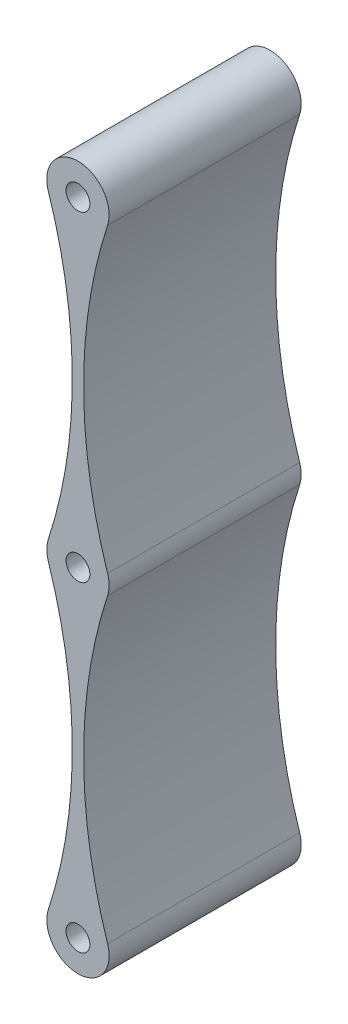
ISO-10303-21;
HEADER;
FILE_DESCRIPTION(('STEP AP214'),'2;1');
FILE_NAME('part.step','',(''),(''),'','','');
FILE_SCHEMA(('AUTOMOTIVE_DESIGN { 1 0 10303 214 1 1 1 1 }'));
ENDSEC;
DATA;
#1=APPLICATION_CONTEXT('core data for automotive mechanical design processes');
#2=APPLICATION_PROTOCOL_DEFINITION('international standard','automotive_design',2000,#1);
#3=PRODUCT_CONTEXT('',#1,'mechanical');
#4=PRODUCT('Part','Part','',(#3));
#5=PRODUCT_RELATED_PRODUCT_CATEGORY('part','',(#4));
#6=PRODUCT_DEFINITION_FORMATION('','',#4);
#7=PRODUCT_DEFINITION_CONTEXT('part definition',#1,'design');
#8=PRODUCT_DEFINITION('design','',#6,#7);
#9=PRODUCT_DEFINITION_SHAPE('','',#8);
#10=(LENGTH_UNIT() NAMED_UNIT(*) SI_UNIT(.MILLI.,.METRE.));
#11=(NAMED_UNIT(*) PLANE_ANGLE_UNIT() SI_UNIT($,.RADIAN.));
#12=(NAMED_UNIT(*) SI_UNIT($,.STERADIAN.) SOLID_ANGLE_UNIT());
#13=UNCERTAINTY_MEASURE_WITH_UNIT(LENGTH_MEASURE(1.E-05),#10,'distance_accuracy_value','');
#14=(GEOMETRIC_REPRESENTATION_CONTEXT(3) GLOBAL_UNCERTAINTY_ASSIGNED_CONTEXT((#13)) GLOBAL_UNIT_ASSIGNED_CONTEXT((#10,
#11,#12)) REPRESENTATION_CONTEXT('',''));
#15=CARTESIAN_POINT('',(0.,0.,0.));
#16=DIRECTION('',(0.,0.,1.));
#17=DIRECTION('',(1.,0.,0.));
#18=AXIS2_PLACEMENT_3D('',#15,#16,#17);
#19=CARTESIAN_POINT('',(0.,-10.5,141.636166032964));
#20=DIRECTION('',(0.,0.,-1.));
#21=DIRECTION('',(-1.,0.,0.));
#22=AXIS2_PLACEMENT_3D('',#19,#20,#21);
#23=CYLINDRICAL_SURFACE('',#22,2.1);
#24=CARTESIAN_POINT('',(0.,-10.5,16.95));
#25=DIRECTION('',(0.,0.,1.));
#26=DIRECTION('',(1.,0.,0.));
#27=AXIS2_PLACEMENT_3D('',#24,#25,#26);
#28=CIRCLE('',#27,2.1);
#29=CARTESIAN_POINT('',(2.1,-10.5,16.95));
#30=VERTEX_POINT('',#29);
#31=EDGE_CURVE('E144',#30,#30,#28,.T.);
#32=ORIENTED_EDGE('',*,*,#31,.T.);
#33=EDGE_LOOP('',(#32));
#34=FACE_BOUND('',#33,.T.);
#35=CARTESIAN_POINT('',(0.,-10.5,-16.95));
#36=DIRECTION('',(0.,0.,1.));
#37=DIRECTION('',(1.,0.,0.));
#38=AXIS2_PLACEMENT_3D('',#35,#36,#37);
#39=CIRCLE('',#38,2.1);
#40=CARTESIAN_POINT('',(2.1,-10.5,-16.95));
#41=VERTEX_POINT('',#40);
#42=EDGE_CURVE('E120',#41,#41,#39,.F.);
#43=ORIENTED_EDGE('',*,*,#42,.T.);
#44=EDGE_LOOP('',(#43));
#45=FACE_BOUND('',#44,.T.);
#46=ADVANCED_FACE('F33',(#34,#45),#23,.F.);
#47=CARTESIAN_POINT('',(0.,-123.7,141.636166032964));
#48=DIRECTION('',(0.,0.,-1.));
#49=DIRECTION('',(-1.,0.,0.));
#50=AXIS2_PLACEMENT_3D('',#47,#48,#49);
#51=CYLINDRICAL_SURFACE('',#50,2.1);
#52=CARTESIAN_POINT('',(0.,-123.7,16.95));
#53=DIRECTION('',(0.,0.,1.));
#54=DIRECTION('',(1.,0.,0.));
#55=AXIS2_PLACEMENT_3D('',#52,#53,#54);
#56=CIRCLE('',#55,2.1);
#57=CARTESIAN_POINT('',(2.10000000000001,-123.7,16.95));
#58=VERTEX_POINT('',#57);
#59=EDGE_CURVE('E147',#58,#58,#56,.T.);
#60=ORIENTED_EDGE('',*,*,#59,.T.);
#61=EDGE_LOOP('',(#60));
#62=FACE_BOUND('',#61,.T.);
#63=CARTESIAN_POINT('',(0.,-123.7,-16.95));
#64=DIRECTION('',(0.,0.,1.));
#65=DIRECTION('',(1.,0.,0.));
#66=AXIS2_PLACEMENT_3D('',#63,#64,#65);
#67=CIRCLE('',#66,2.1);
#68=CARTESIAN_POINT('',(2.10000000000001,-123.7,-16.95));
#69=VERTEX_POINT('',#68);
#70=EDGE_CURVE('E129',#69,#69,#67,.F.);
#71=ORIENTED_EDGE('',*,*,#70,.T.);
#72=EDGE_LOOP('',(#71));
#73=FACE_BOUND('',#72,.T.);
#74=ADVANCED_FACE('F207',(#62,#73),#51,.F.);
#75=CARTESIAN_POINT('',(0.,-67.0999999999999,141.636166032964));
#76=DIRECTION('',(0.,0.,-1.));
#77=DIRECTION('',(-1.,0.,0.));
#78=AXIS2_PLACEMENT_3D('',#75,#76,#77);
#79=CYLINDRICAL_SURFACE('',#78,5.49999999999997);
#80=CARTESIAN_POINT('',(0.,-67.0999999999999,16.95));
#81=DIRECTION('',(0.,0.,1.));
#82=DIRECTION('',(1.,0.,0.));
#83=AXIS2_PLACEMENT_3D('',#80,#81,#82);
#84=CIRCLE('',#83,5.49999999999997);
#85=CARTESIAN_POINT('',(5.22873078890315,-68.805981927564,16.95));
#86=VERTEX_POINT('',#85);
#87=CARTESIAN_POINT('',(5.22873078890315,-65.3940180724358,16.95));
#88=VERTEX_POINT('',#87);
#89=EDGE_CURVE('E150',#86,#88,#84,.T.);
#90=ORIENTED_EDGE('',*,*,#89,.F.);
#91=DIRECTION('',(0.,0.,-1.));
#92=VECTOR('',#91,1.);
#93=CARTESIAN_POINT('',(5.22873078890315,-68.805981927564,141.636166032964));
#94=LINE('',#93,#92);
#95=CARTESIAN_POINT('',(5.22873078890315,-68.805981927564,-16.95));
#96=VERTEX_POINT('',#95);
#97=EDGE_CURVE('E49',#86,#96,#94,.T.);
#98=ORIENTED_EDGE('',*,*,#97,.T.);
#99=CARTESIAN_POINT('',(0.,-67.0999999999999,-16.95));
#100=DIRECTION('',(0.,0.,1.));
#101=DIRECTION('',(1.,0.,0.));
#102=AXIS2_PLACEMENT_3D('',#99,#100,#101);
#103=CIRCLE('',#102,5.49999999999997);
#104=CARTESIAN_POINT('',(5.22873078890315,-65.3940180724358,-16.95));
#105=VERTEX_POINT('',#104);
#106=EDGE_CURVE('E126',#105,#96,#103,.F.);
#107=ORIENTED_EDGE('',*,*,#106,.F.);
#108=DIRECTION('',(0.,0.,-1.));
#109=VECTOR('',#108,1.);
#110=CARTESIAN_POINT('',(5.22873078890315,-65.3940180724358,141.636166032964));
#111=LINE('',#110,#109);
#112=EDGE_CURVE('E170',#88,#105,#111,.T.);
#113=ORIENTED_EDGE('',*,*,#112,.F.);
#114=EDGE_LOOP('',(#90,#98,#107,#113));
#115=FACE_BOUND('',#114,.T.);
#116=ADVANCED_FACE('F188',(#115),#79,.T.);
#117=CARTESIAN_POINT('',(86.7377777777772,-95.4,141.636166032964));
#118=DIRECTION('',(0.,0.,-1.));
#119=DIRECTION('',(-1.,0.,0.));
#120=AXIS2_PLACEMENT_3D('',#117,#118,#119);
#121=CYLINDRICAL_SURFACE('',#120,85.7377777777773);
#122=CARTESIAN_POINT('',(86.7377777777772,-95.4,16.95));
#123=DIRECTION('',(0.,0.,1.));
#124=DIRECTION('',(1.,0.,0.));
#125=AXIS2_PLACEMENT_3D('',#122,#123,#124);
#126=CIRCLE('',#125,85.7377777777773);
#127=CARTESIAN_POINT('',(5.22873078890315,-121.994018072436,16.95));
#128=VERTEX_POINT('',#127);
#129=EDGE_CURVE('E153',#128,#86,#126,.F.);
#130=ORIENTED_EDGE('',*,*,#129,.F.);
#131=DIRECTION('',(0.,0.,-1.));
#132=VECTOR('',#131,1.);
#133=CARTESIAN_POINT('',(5.22873078890315,-121.994018072436,141.636166032964));
#134=LINE('',#133,#132);
#135=CARTESIAN_POINT('',(5.22873078890315,-121.994018072436,-16.95));
#136=VERTEX_POINT('',#135);
#137=EDGE_CURVE('E173',#128,#136,#134,.T.);
#138=ORIENTED_EDGE('',*,*,#137,.T.);
#139=CARTESIAN_POINT('',(86.7377777777772,-95.4,-16.95));
#140=DIRECTION('',(0.,0.,1.));
#141=DIRECTION('',(1.,0.,0.));
#142=AXIS2_PLACEMENT_3D('',#139,#140,#141);
#143=CIRCLE('',#142,85.7377777777773);
#144=EDGE_CURVE('E137',#96,#136,#143,.T.);
#145=ORIENTED_EDGE('',*,*,#144,.F.);
#146=ORIENTED_EDGE('',*,*,#97,.F.);
#147=EDGE_LOOP('',(#130,#138,#145,#146));
#148=FACE_BOUND('',#147,.T.);
#149=ADVANCED_FACE('F190',(#148),#121,.F.);
#150=CARTESIAN_POINT('',(0.,-123.7,141.636166032964));
#151=DIRECTION('',(0.,0.,-1.));
#152=DIRECTION('',(-1.,0.,0.));
#153=AXIS2_PLACEMENT_3D('',#150,#151,#152);
#154=CYLINDRICAL_SURFACE('',#153,5.49999999999992);
#155=CARTESIAN_POINT('',(0.,-123.7,16.95));
#156=DIRECTION('',(0.,0.,1.));
#157=DIRECTION('',(1.,0.,0.));
#158=AXIS2_PLACEMENT_3D('',#155,#156,#157);
#159=CIRCLE('',#158,5.49999999999992);
#160=CARTESIAN_POINT('',(-5.22873078890326,-121.994018072436,16.95));
#161=VERTEX_POINT('',#160);
#162=EDGE_CURVE('E156',#161,#128,#159,.T.);
#163=ORIENTED_EDGE('',*,*,#162,.F.);
#164=DIRECTION('',(0.,0.,-1.));
#165=VECTOR('',#164,1.);
#166=CARTESIAN_POINT('',(-5.22873078890326,-121.994018072436,141.636166032964));
#167=LINE('',#166,#165);
#168=CARTESIAN_POINT('',(-5.22873078890326,-121.994018072436,-16.95));
#169=VERTEX_POINT('',#168);
#170=EDGE_CURVE('E175',#161,#169,#167,.T.);
#171=ORIENTED_EDGE('',*,*,#170,.T.);
#172=CARTESIAN_POINT('',(0.,-123.7,-16.95));
#173=DIRECTION('',(0.,0.,1.));
#174=DIRECTION('',(1.,0.,0.));
#175=AXIS2_PLACEMENT_3D('',#172,#173,#174);
#176=CIRCLE('',#175,5.49999999999992);
#177=EDGE_CURVE('E134',#136,#169,#176,.F.);
#178=ORIENTED_EDGE('',*,*,#177,.F.);
#179=ORIENTED_EDGE('',*,*,#137,.F.);
#180=EDGE_LOOP('',(#163,#171,#178,#179));
#181=FACE_BOUND('',#180,.T.);
#182=ADVANCED_FACE('F193',(#181),#154,.T.);
#183=CARTESIAN_POINT('',(-86.7377777777774,-95.3999999999998,141.636166032964));
#184=DIRECTION('',(0.,0.,-1.));
#185=DIRECTION('',(-1.,0.,0.));
#186=AXIS2_PLACEMENT_3D('',#183,#184,#185);
#187=CYLINDRICAL_SURFACE('',#186,85.7377777777774);
#188=CARTESIAN_POINT('',(-86.7377777777774,-95.3999999999998,16.95));
#189=DIRECTION('',(0.,0.,1.));
#190=DIRECTION('',(1.,0.,0.));
#191=AXIS2_PLACEMENT_3D('',#188,#189,#190);
#192=CIRCLE('',#191,85.7377777777774);
#193=CARTESIAN_POINT('',(-5.22873078890327,-68.805981927564,16.95));
#194=VERTEX_POINT('',#193);
#195=EDGE_CURVE('E159',#194,#161,#192,.F.);
#196=ORIENTED_EDGE('',*,*,#195,.F.);
#197=DIRECTION('',(0.,0.,-1.));
#198=VECTOR('',#197,1.);
#199=CARTESIAN_POINT('',(-5.22873078890327,-68.805981927564,141.636166032964));
#200=LINE('',#199,#198);
#201=CARTESIAN_POINT('',(-5.22873078890327,-68.805981927564,-16.95));
#202=VERTEX_POINT('',#201);
#203=EDGE_CURVE('E177',#194,#202,#200,.T.);
#204=ORIENTED_EDGE('',*,*,#203,.T.);
#205=CARTESIAN_POINT('',(-86.7377777777774,-95.3999999999998,-16.95));
#206=DIRECTION('',(0.,0.,1.));
#207=DIRECTION('',(1.,0.,0.));
#208=AXIS2_PLACEMENT_3D('',#205,#206,#207);
#209=CIRCLE('',#208,85.7377777777774);
#210=EDGE_CURVE('E132',#169,#202,#209,.T.);
#211=ORIENTED_EDGE('',*,*,#210,.F.);
#212=ORIENTED_EDGE('',*,*,#170,.F.);
#213=EDGE_LOOP('',(#196,#204,#211,#212));
#214=FACE_BOUND('',#213,.T.);
#215=ADVANCED_FACE('F197',(#214),#187,.F.);
#216=CARTESIAN_POINT('',(0.,-67.0999999999999,141.636166032964));
#217=DIRECTION('',(0.,0.,-1.));
#218=DIRECTION('',(-1.,0.,0.));
#219=AXIS2_PLACEMENT_3D('',#216,#217,#218);
#220=CYLINDRICAL_SURFACE('',#219,5.49999999999997);
#221=CARTESIAN_POINT('',(0.,-67.0999999999999,16.95));
#222=DIRECTION('',(0.,0.,1.));
#223=DIRECTION('',(1.,0.,0.));
#224=AXIS2_PLACEMENT_3D('',#221,#222,#223);
#225=CIRCLE('',#224,5.49999999999997);
#226=CARTESIAN_POINT('',(-5.22873078890328,-65.3940180724358,16.95));
#227=VERTEX_POINT('',#226);
#228=EDGE_CURVE('E162',#227,#194,#225,.T.);
#229=ORIENTED_EDGE('',*,*,#228,.F.);
#230=DIRECTION('',(0.,0.,-1.));
#231=VECTOR('',#230,1.);
#232=CARTESIAN_POINT('',(-5.22873078890328,-65.3940180724358,141.636166032964));
#233=LINE('',#232,#231);
#234=CARTESIAN_POINT('',(-5.22873078890328,-65.3940180724358,-16.95));
#235=VERTEX_POINT('',#234);
#236=EDGE_CURVE('E105',#227,#235,#233,.T.);
#237=ORIENTED_EDGE('',*,*,#236,.T.);
#238=CARTESIAN_POINT('',(0.,-67.0999999999999,-16.95));
#239=DIRECTION('',(0.,0.,1.));
#240=DIRECTION('',(1.,0.,0.));
#241=AXIS2_PLACEMENT_3D('',#238,#239,#240);
#242=CIRCLE('',#241,5.49999999999997);
#243=EDGE_CURVE('E117',#202,#235,#242,.F.);
#244=ORIENTED_EDGE('',*,*,#243,.F.);
#245=ORIENTED_EDGE('',*,*,#203,.F.);
#246=EDGE_LOOP('',(#229,#237,#244,#245));
#247=FACE_BOUND('',#246,.T.);
#248=ADVANCED_FACE('F180',(#247),#220,.T.);
#249=CARTESIAN_POINT('',(-86.7377777777774,-38.7999999999999,141.636166032964));
#250=DIRECTION('',(0.,0.,-1.));
#251=DIRECTION('',(-1.,0.,0.));
#252=AXIS2_PLACEMENT_3D('',#249,#250,#251);
#253=CYLINDRICAL_SURFACE('',#252,85.7377777777773);
#254=CARTESIAN_POINT('',(-86.7377777777774,-38.7999999999999,16.95));
#255=DIRECTION('',(0.,0.,1.));
#256=DIRECTION('',(1.,0.,0.));
#257=AXIS2_PLACEMENT_3D('',#254,#255,#256);
#258=CIRCLE('',#257,85.7377777777773);
#259=CARTESIAN_POINT('',(-5.22873078890326,-12.2059819275641,16.95));
#260=VERTEX_POINT('',#259);
#261=EDGE_CURVE('E103',#260,#227,#258,.F.);
#262=ORIENTED_EDGE('',*,*,#261,.F.);
#263=DIRECTION('',(0.,0.,-1.));
#264=VECTOR('',#263,1.);
#265=CARTESIAN_POINT('',(-5.22873078890326,-12.2059819275641,141.636166032964));
#266=LINE('',#265,#264);
#267=CARTESIAN_POINT('',(-5.22873078890326,-12.2059819275641,-16.95));
#268=VERTEX_POINT('',#267);
#269=EDGE_CURVE('E42',#260,#268,#266,.T.);
#270=ORIENTED_EDGE('',*,*,#269,.T.);
#271=CARTESIAN_POINT('',(-86.7377777777774,-38.7999999999999,-16.95));
#272=DIRECTION('',(0.,0.,1.));
#273=DIRECTION('',(1.,0.,0.));
#274=AXIS2_PLACEMENT_3D('',#271,#272,#273);
#275=CIRCLE('',#274,85.7377777777773);
#276=EDGE_CURVE('E101',#235,#268,#275,.T.);
#277=ORIENTED_EDGE('',*,*,#276,.F.);
#278=ORIENTED_EDGE('',*,*,#236,.F.);
#279=EDGE_LOOP('',(#262,#270,#277,#278));
#280=FACE_BOUND('',#279,.T.);
#281=ADVANCED_FACE('F99',(#280),#253,.F.);
#282=CARTESIAN_POINT('',(0.,-10.5,141.636166032964));
#283=DIRECTION('',(0.,0.,-1.));
#284=DIRECTION('',(-1.,0.,0.));
#285=AXIS2_PLACEMENT_3D('',#282,#283,#284);
#286=CYLINDRICAL_SURFACE('',#285,5.50000000000002);
#287=CARTESIAN_POINT('',(0.,-10.5,16.95));
#288=DIRECTION('',(0.,0.,1.));
#289=DIRECTION('',(1.,0.,0.));
#290=AXIS2_PLACEMENT_3D('',#287,#288,#289);
#291=CIRCLE('',#290,5.50000000000002);
#292=CARTESIAN_POINT('',(5.22873078890324,-12.2059819275642,16.95));
#293=VERTEX_POINT('',#292);
#294=EDGE_CURVE('E56',#293,#260,#291,.T.);
#295=ORIENTED_EDGE('',*,*,#294,.F.);
#296=DIRECTION('',(0.,0.,-1.));
#297=VECTOR('',#296,1.);
#298=CARTESIAN_POINT('',(5.22873078890324,-12.2059819275642,141.636166032964));
#299=LINE('',#298,#297);
#300=CARTESIAN_POINT('',(5.22873078890324,-12.2059819275642,-16.95));
#301=VERTEX_POINT('',#300);
#302=EDGE_CURVE('E11',#293,#301,#299,.T.);
#303=ORIENTED_EDGE('',*,*,#302,.T.);
#304=CARTESIAN_POINT('',(0.,-10.5,-16.95));
#305=DIRECTION('',(0.,0.,1.));
#306=DIRECTION('',(1.,0.,0.));
#307=AXIS2_PLACEMENT_3D('',#304,#305,#306);
#308=CIRCLE('',#307,5.50000000000002);
#309=EDGE_CURVE('E113',#268,#301,#308,.F.);
#310=ORIENTED_EDGE('',*,*,#309,.F.);
#311=ORIENTED_EDGE('',*,*,#269,.F.);
#312=EDGE_LOOP('',(#295,#303,#310,#311));
#313=FACE_BOUND('',#312,.T.);
#314=ADVANCED_FACE('F119',(#313),#286,.T.);
#315=CARTESIAN_POINT('',(86.7377777777773,-38.8000000000001,141.636166032964));
#316=DIRECTION('',(0.,0.,-1.));
#317=DIRECTION('',(-1.,0.,0.));
#318=AXIS2_PLACEMENT_3D('',#315,#316,#317);
#319=CYLINDRICAL_SURFACE('',#318,85.7377777777774);
#320=CARTESIAN_POINT('',(86.7377777777773,-38.8000000000001,16.95));
#321=DIRECTION('',(0.,0.,1.));
#322=DIRECTION('',(1.,0.,0.));
#323=AXIS2_PLACEMENT_3D('',#320,#321,#322);
#324=CIRCLE('',#323,85.7377777777774);
#325=EDGE_CURVE('E167',#88,#293,#324,.F.);
#326=ORIENTED_EDGE('',*,*,#325,.F.);
#327=ORIENTED_EDGE('',*,*,#112,.T.);
#328=CARTESIAN_POINT('',(86.7377777777773,-38.8000000000001,-16.95));
#329=DIRECTION('',(0.,0.,1.));
#330=DIRECTION('',(1.,0.,0.));
#331=AXIS2_PLACEMENT_3D('',#328,#329,#330);
#332=CIRCLE('',#331,85.7377777777774);
#333=EDGE_CURVE('E121',#301,#105,#332,.T.);
#334=ORIENTED_EDGE('',*,*,#333,.F.);
#335=ORIENTED_EDGE('',*,*,#302,.F.);
#336=EDGE_LOOP('',(#326,#327,#334,#335));
#337=FACE_BOUND('',#336,.T.);
#338=ADVANCED_FACE('F35',(#337),#319,.F.);
#339=CARTESIAN_POINT('',(0.,-67.0999999999999,141.636166032964));
#340=DIRECTION('',(0.,0.,-1.));
#341=DIRECTION('',(-1.,0.,0.));
#342=AXIS2_PLACEMENT_3D('',#339,#340,#341);
#343=CYLINDRICAL_SURFACE('',#342,2.1);
#344=CARTESIAN_POINT('',(0.,-67.0999999999999,16.95));
#345=DIRECTION('',(0.,0.,1.));
#346=DIRECTION('',(1.,0.,0.));
#347=AXIS2_PLACEMENT_3D('',#344,#345,#346);
#348=CIRCLE('',#347,2.1);
#349=CARTESIAN_POINT('',(2.09999999999995,-67.0999999999999,16.95));
#350=VERTEX_POINT('',#349);
#351=EDGE_CURVE('E37',#350,#350,#348,.T.);
#352=ORIENTED_EDGE('',*,*,#351,.T.);
#353=EDGE_LOOP('',(#352));
#354=FACE_BOUND('',#353,.T.);
#355=CARTESIAN_POINT('',(0.,-67.0999999999999,-16.95));
#356=DIRECTION('',(0.,0.,1.));
#357=DIRECTION('',(1.,0.,0.));
#358=AXIS2_PLACEMENT_3D('',#355,#356,#357);
#359=CIRCLE('',#358,2.1);
#360=CARTESIAN_POINT('',(2.09999999999995,-67.0999999999999,-16.95));
#361=VERTEX_POINT('',#360);
#362=EDGE_CURVE('E124',#361,#361,#359,.F.);
#363=ORIENTED_EDGE('',*,*,#362,.T.);
#364=EDGE_LOOP('',(#363));
#365=FACE_BOUND('',#364,.T.);
#366=ADVANCED_FACE('F217',(#354,#365),#343,.F.);
#367=CARTESIAN_POINT('',(0.,60.8000000000002,16.95));
#368=DIRECTION('',(0.,0.,1.));
#369=DIRECTION('',(1.,0.,0.));
#370=AXIS2_PLACEMENT_3D('',#367,#368,#369);
#371=PLANE('',#370);
#372=ORIENTED_EDGE('',*,*,#351,.F.);
#373=EDGE_LOOP('',(#372));
#374=FACE_BOUND('',#373,.T.);
#375=ORIENTED_EDGE('',*,*,#31,.F.);
#376=EDGE_LOOP('',(#375));
#377=FACE_BOUND('',#376,.T.);
#378=ORIENTED_EDGE('',*,*,#59,.F.);
#379=EDGE_LOOP('',(#378));
#380=FACE_BOUND('',#379,.T.);
#381=ORIENTED_EDGE('',*,*,#89,.T.);
#382=ORIENTED_EDGE('',*,*,#325,.T.);
#383=ORIENTED_EDGE('',*,*,#294,.T.);
#384=ORIENTED_EDGE('',*,*,#261,.T.);
#385=ORIENTED_EDGE('',*,*,#228,.T.);
#386=ORIENTED_EDGE('',*,*,#195,.T.);
#387=ORIENTED_EDGE('',*,*,#162,.T.);
#388=ORIENTED_EDGE('',*,*,#129,.T.);
#389=EDGE_LOOP('',(#381,#382,#383,#384,#385,#386,#387,#388));
#390=FACE_BOUND('',#389,.T.);
#391=ADVANCED_FACE('F183',(#374,#377,#380,#390),#371,.T.);
#392=CARTESIAN_POINT('',(0.,60.8000000000002,-16.95));
#393=DIRECTION('',(0.,0.,1.));
#394=DIRECTION('',(1.,0.,0.));
#395=AXIS2_PLACEMENT_3D('',#392,#393,#394);
#396=PLANE('',#395);
#397=ORIENTED_EDGE('',*,*,#333,.T.);
#398=ORIENTED_EDGE('',*,*,#106,.T.);
#399=ORIENTED_EDGE('',*,*,#144,.T.);
#400=ORIENTED_EDGE('',*,*,#177,.T.);
#401=ORIENTED_EDGE('',*,*,#210,.T.);
#402=ORIENTED_EDGE('',*,*,#243,.T.);
#403=ORIENTED_EDGE('',*,*,#276,.T.);
#404=ORIENTED_EDGE('',*,*,#309,.T.);
#405=EDGE_LOOP('',(#397,#398,#399,#400,#401,#402,#403,#404));
#406=FACE_BOUND('',#405,.T.);
#407=ORIENTED_EDGE('',*,*,#42,.F.);
#408=EDGE_LOOP('',(#407));
#409=FACE_BOUND('',#408,.T.);
#410=ORIENTED_EDGE('',*,*,#362,.F.);
#411=EDGE_LOOP('',(#410));
#412=FACE_BOUND('',#411,.T.);
#413=ORIENTED_EDGE('',*,*,#70,.F.);
#414=EDGE_LOOP('',(#413));
#415=FACE_BOUND('',#414,.T.);
#416=ADVANCED_FACE('F111',(#406,#409,#412,#415),#396,.F.);
#417=CLOSED_SHELL('',(#46,#74,#116,#149,#182,#215,#248,#281,#314,#338,#366,#391,#416));
#418=MANIFOLD_SOLID_BREP('B2',#417);
#419=ADVANCED_BREP_SHAPE_REPRESENTATION('',(#18,#418),#14);
#420=SHAPE_DEFINITION_REPRESENTATION(#9,#419);
ENDSEC;
END-ISO-10303-21;
